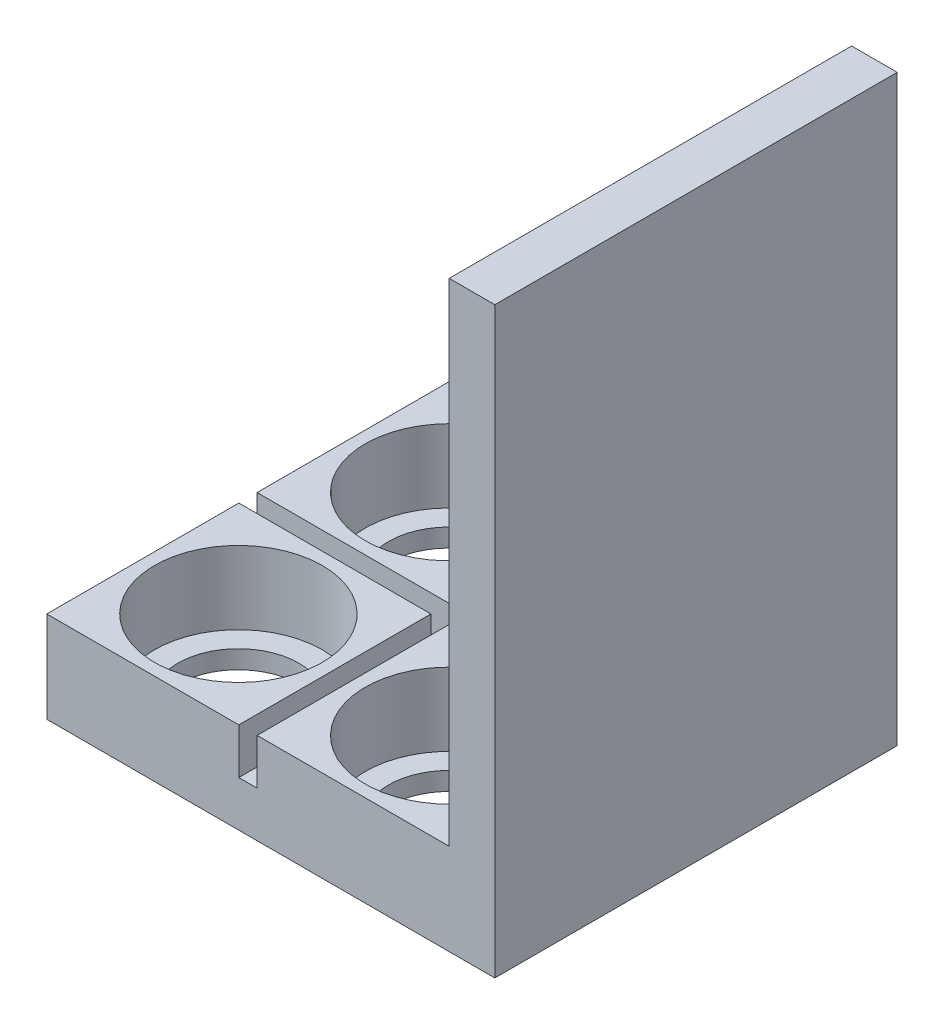
ISO-10303-21;
HEADER;
FILE_DESCRIPTION(('STEP AP214'),'2;1');
FILE_NAME('part.step','',(''),(''),'','','');
FILE_SCHEMA(('AUTOMOTIVE_DESIGN { 1 0 10303 214 1 1 1 1 }'));
ENDSEC;
DATA;
#1=APPLICATION_CONTEXT('core data for automotive mechanical design processes');
#2=APPLICATION_PROTOCOL_DEFINITION('international standard','automotive_design',2000,#1);
#3=PRODUCT_CONTEXT('',#1,'mechanical');
#4=PRODUCT('Part','Part','',(#3));
#5=PRODUCT_RELATED_PRODUCT_CATEGORY('part','',(#4));
#6=PRODUCT_DEFINITION_FORMATION('','',#4);
#7=PRODUCT_DEFINITION_CONTEXT('part definition',#1,'design');
#8=PRODUCT_DEFINITION('design','',#6,#7);
#9=PRODUCT_DEFINITION_SHAPE('','',#8);
#10=(LENGTH_UNIT() NAMED_UNIT(*) SI_UNIT(.MILLI.,.METRE.));
#11=(NAMED_UNIT(*) PLANE_ANGLE_UNIT() SI_UNIT($,.RADIAN.));
#12=(NAMED_UNIT(*) SI_UNIT($,.STERADIAN.) SOLID_ANGLE_UNIT());
#13=UNCERTAINTY_MEASURE_WITH_UNIT(LENGTH_MEASURE(1.E-05),#10,'distance_accuracy_value','');
#14=(GEOMETRIC_REPRESENTATION_CONTEXT(3) GLOBAL_UNCERTAINTY_ASSIGNED_CONTEXT((#13)) GLOBAL_UNIT_ASSIGNED_CONTEXT((#10,
#11,#12)) REPRESENTATION_CONTEXT('',''));
#15=CARTESIAN_POINT('',(0.,0.,0.));
#16=DIRECTION('',(0.,0.,1.));
#17=DIRECTION('',(1.,0.,0.));
#18=AXIS2_PLACEMENT_3D('',#15,#16,#17);
#19=CARTESIAN_POINT('',(0.,10.,0.));
#20=DIRECTION('',(0.,1.,0.));
#21=DIRECTION('',(0.,0.,1.));
#22=AXIS2_PLACEMENT_3D('',#19,#20,#21);
#23=PLANE('',#22);
#24=CARTESIAN_POINT('',(33.6,10.,11.55));
#25=DIRECTION('',(0.,1.,0.));
#26=DIRECTION('',(0.,0.,-1.));
#27=AXIS2_PLACEMENT_3D('',#24,#25,#26);
#28=CIRCLE('',#27,9.19999999999999);
#29=CARTESIAN_POINT('',(33.6,10.,2.35000000000001));
#30=VERTEX_POINT('',#29);
#31=EDGE_CURVE('E212',#30,#30,#28,.T.);
#32=ORIENTED_EDGE('',*,*,#31,.F.);
#33=EDGE_LOOP('',(#32));
#34=FACE_BOUND('',#33,.T.);
#35=DIRECTION('',(1.,0.,0.));
#36=VECTOR('',#35,1.);
#37=CARTESIAN_POINT('',(0.,10.,22.05));
#38=LINE('',#37,#36);
#39=CARTESIAN_POINT('',(23.05,10.,22.05));
#40=VERTEX_POINT('',#39);
#41=CARTESIAN_POINT('',(44.1,10.,22.05));
#42=VERTEX_POINT('',#41);
#43=EDGE_CURVE('E246',#40,#42,#38,.T.);
#44=ORIENTED_EDGE('',*,*,#43,.T.);
#45=DIRECTION('',(0.,0.,1.));
#46=VECTOR('',#45,1.);
#47=CARTESIAN_POINT('',(44.1,10.,-22.05));
#48=LINE('',#47,#46);
#49=CARTESIAN_POINT('',(44.1,10.,1.));
#50=VERTEX_POINT('',#49);
#51=EDGE_CURVE('E158',#50,#42,#48,.T.);
#52=ORIENTED_EDGE('',*,*,#51,.F.);
#53=DIRECTION('',(1.,0.,0.));
#54=VECTOR('',#53,1.);
#55=CARTESIAN_POINT('',(23.05,10.,1.));
#56=LINE('',#55,#54);
#57=CARTESIAN_POINT('',(23.05,10.,1.));
#58=VERTEX_POINT('',#57);
#59=EDGE_CURVE('E149',#58,#50,#56,.T.);
#60=ORIENTED_EDGE('',*,*,#59,.F.);
#61=DIRECTION('',(0.,0.,-1.));
#62=VECTOR('',#61,1.);
#63=CARTESIAN_POINT('',(23.05,10.,0.));
#64=LINE('',#63,#62);
#65=EDGE_CURVE('E55',#40,#58,#64,.T.);
#66=ORIENTED_EDGE('',*,*,#65,.F.);
#67=EDGE_LOOP('',(#44,#52,#60,#66));
#68=FACE_BOUND('',#67,.T.);
#69=ADVANCED_FACE('F47',(#34,#68),#23,.T.);
#70=CARTESIAN_POINT('',(33.6,10.,-11.55));
#71=DIRECTION('',(0.,-1.,0.));
#72=DIRECTION('',(0.,0.,1.));
#73=AXIS2_PLACEMENT_3D('',#70,#71,#72);
#74=CIRCLE('',#73,9.19999999999999);
#75=CARTESIAN_POINT('',(33.6,10.,-2.35000000000001));
#76=VERTEX_POINT('',#75);
#77=EDGE_CURVE('E218',#76,#76,#74,.T.);
#78=ORIENTED_EDGE('',*,*,#77,.T.);
#79=EDGE_LOOP('',(#78));
#80=FACE_BOUND('',#79,.T.);
#81=DIRECTION('',(-1.,0.,0.));
#82=VECTOR('',#81,1.);
#83=CARTESIAN_POINT('',(0.,10.,-1.));
#84=LINE('',#83,#82);
#85=CARTESIAN_POINT('',(44.1,10.,-1.00000000000003));
#86=VERTEX_POINT('',#85);
#87=CARTESIAN_POINT('',(23.05,10.,-1.00000000000001));
#88=VERTEX_POINT('',#87);
#89=EDGE_CURVE('E11',#86,#88,#84,.T.);
#90=ORIENTED_EDGE('',*,*,#89,.F.);
#91=CARTESIAN_POINT('',(44.1,10.,-22.05));
#92=VERTEX_POINT('',#91);
#93=EDGE_CURVE('E296',#92,#86,#48,.T.);
#94=ORIENTED_EDGE('',*,*,#93,.F.);
#95=DIRECTION('',(-1.,0.,0.));
#96=VECTOR('',#95,1.);
#97=CARTESIAN_POINT('',(0.,10.,-22.05));
#98=LINE('',#97,#96);
#99=CARTESIAN_POINT('',(23.05,10.,-22.05));
#100=VERTEX_POINT('',#99);
#101=EDGE_CURVE('E108',#92,#100,#98,.T.);
#102=ORIENTED_EDGE('',*,*,#101,.T.);
#103=DIRECTION('',(0.,0.,-1.));
#104=VECTOR('',#103,1.);
#105=CARTESIAN_POINT('',(23.05,10.,-22.05));
#106=LINE('',#105,#104);
#107=EDGE_CURVE('E159',#88,#100,#106,.T.);
#108=ORIENTED_EDGE('',*,*,#107,.F.);
#109=EDGE_LOOP('',(#90,#94,#102,#108));
#110=FACE_BOUND('',#109,.T.);
#111=ADVANCED_FACE('F418',(#80,#110),#23,.T.);
#112=DIRECTION('',(0.,0.,1.));
#113=VECTOR('',#112,1.);
#114=CARTESIAN_POINT('',(21.05,10.,1.));
#115=LINE('',#114,#113);
#116=CARTESIAN_POINT('',(21.05,10.,1.));
#117=VERTEX_POINT('',#116);
#118=CARTESIAN_POINT('',(21.05,10.,22.05));
#119=VERTEX_POINT('',#118);
#120=EDGE_CURVE('E160',#117,#119,#115,.T.);
#121=ORIENTED_EDGE('',*,*,#120,.F.);
#122=DIRECTION('',(1.,0.,0.));
#123=VECTOR('',#122,1.);
#124=CARTESIAN_POINT('',(0.,10.,1.));
#125=LINE('',#124,#123);
#126=CARTESIAN_POINT('',(0.,10.,1.));
#127=VERTEX_POINT('',#126);
#128=EDGE_CURVE('E166',#127,#117,#125,.T.);
#129=ORIENTED_EDGE('',*,*,#128,.F.);
#130=DIRECTION('',(0.,0.,1.));
#131=VECTOR('',#130,1.);
#132=CARTESIAN_POINT('',(0.,10.,-22.05));
#133=LINE('',#132,#131);
#134=CARTESIAN_POINT('',(0.,10.,22.05));
#135=VERTEX_POINT('',#134);
#136=EDGE_CURVE('E97',#127,#135,#133,.T.);
#137=ORIENTED_EDGE('',*,*,#136,.T.);
#138=EDGE_CURVE('E247',#135,#119,#38,.T.);
#139=ORIENTED_EDGE('',*,*,#138,.T.);
#140=EDGE_LOOP('',(#121,#129,#137,#139));
#141=FACE_BOUND('',#140,.T.);
#142=CARTESIAN_POINT('',(10.5,10.,11.55));
#143=DIRECTION('',(0.,-1.,0.));
#144=DIRECTION('',(0.,0.,-1.));
#145=AXIS2_PLACEMENT_3D('',#142,#143,#144);
#146=CIRCLE('',#145,9.19999999999999);
#147=CARTESIAN_POINT('',(10.5,10.,2.35000000000001));
#148=VERTEX_POINT('',#147);
#149=EDGE_CURVE('E230',#148,#148,#146,.T.);
#150=ORIENTED_EDGE('',*,*,#149,.T.);
#151=EDGE_LOOP('',(#150));
#152=FACE_BOUND('',#151,.T.);
#153=ADVANCED_FACE('F356',(#141,#152),#23,.T.);
#154=CARTESIAN_POINT('',(0.,10.,-22.05));
#155=DIRECTION('',(1.,0.,0.));
#156=DIRECTION('',(0.,0.,-1.));
#157=AXIS2_PLACEMENT_3D('',#154,#155,#156);
#158=PLANE('',#157);
#159=ORIENTED_EDGE('',*,*,#136,.F.);
#160=DIRECTION('',(0.,1.,0.));
#161=VECTOR('',#160,1.);
#162=CARTESIAN_POINT('',(0.,5.,1.));
#163=LINE('',#162,#161);
#164=CARTESIAN_POINT('',(0.,5.,1.));
#165=VERTEX_POINT('',#164);
#166=EDGE_CURVE('E180',#165,#127,#163,.T.);
#167=ORIENTED_EDGE('',*,*,#166,.F.);
#168=DIRECTION('',(0.,0.,1.));
#169=VECTOR('',#168,1.);
#170=CARTESIAN_POINT('',(0.,5.,-1.));
#171=LINE('',#170,#169);
#172=CARTESIAN_POINT('',(0.,5.,-1.));
#173=VERTEX_POINT('',#172);
#174=EDGE_CURVE('E327',#173,#165,#171,.T.);
#175=ORIENTED_EDGE('',*,*,#174,.F.);
#176=DIRECTION('',(0.,1.,0.));
#177=VECTOR('',#176,1.);
#178=CARTESIAN_POINT('',(0.,5.,-1.));
#179=LINE('',#178,#177);
#180=CARTESIAN_POINT('',(0.,10.,-1.));
#181=VERTEX_POINT('',#180);
#182=EDGE_CURVE('E183',#173,#181,#179,.T.);
#183=ORIENTED_EDGE('',*,*,#182,.T.);
#184=CARTESIAN_POINT('',(0.,10.,-22.05));
#185=VERTEX_POINT('',#184);
#186=EDGE_CURVE('E106',#185,#181,#133,.T.);
#187=ORIENTED_EDGE('',*,*,#186,.F.);
#188=DIRECTION('',(0.,-1.,0.));
#189=VECTOR('',#188,1.);
#190=CARTESIAN_POINT('',(0.,10.,-22.05));
#191=LINE('',#190,#189);
#192=CARTESIAN_POINT('',(0.,0.,-22.05));
#193=VERTEX_POINT('',#192);
#194=EDGE_CURVE('E87',#185,#193,#191,.T.);
#195=ORIENTED_EDGE('',*,*,#194,.T.);
#196=DIRECTION('',(0.,0.,1.));
#197=VECTOR('',#196,1.);
#198=CARTESIAN_POINT('',(0.,0.,-22.05));
#199=LINE('',#198,#197);
#200=CARTESIAN_POINT('',(0.,0.,22.05));
#201=VERTEX_POINT('',#200);
#202=EDGE_CURVE('E104',#193,#201,#199,.T.);
#203=ORIENTED_EDGE('',*,*,#202,.T.);
#204=DIRECTION('',(0.,-1.,0.));
#205=VECTOR('',#204,1.);
#206=CARTESIAN_POINT('',(0.,10.,22.05));
#207=LINE('',#206,#205);
#208=EDGE_CURVE('E107',#135,#201,#207,.T.);
#209=ORIENTED_EDGE('',*,*,#208,.F.);
#210=EDGE_LOOP('',(#159,#167,#175,#183,#187,#195,#203,#209));
#211=FACE_BOUND('',#210,.T.);
#212=ADVANCED_FACE('F49',(#211),#158,.F.);
#213=CARTESIAN_POINT('',(0.,10.,22.05));
#214=DIRECTION('',(0.,0.,-1.));
#215=DIRECTION('',(-1.,0.,0.));
#216=AXIS2_PLACEMENT_3D('',#213,#214,#215);
#217=PLANE('',#216);
#218=ORIENTED_EDGE('',*,*,#43,.F.);
#219=DIRECTION('',(0.,-1.,0.));
#220=VECTOR('',#219,1.);
#221=CARTESIAN_POINT('',(23.05,10.,22.05));
#222=LINE('',#221,#220);
#223=CARTESIAN_POINT('',(23.05,5.,22.05));
#224=VERTEX_POINT('',#223);
#225=EDGE_CURVE('E136',#40,#224,#222,.T.);
#226=ORIENTED_EDGE('',*,*,#225,.T.);
#227=DIRECTION('',(1.,0.,0.));
#228=VECTOR('',#227,1.);
#229=CARTESIAN_POINT('',(0.,5.,22.05));
#230=LINE('',#229,#228);
#231=CARTESIAN_POINT('',(21.05,5.,22.05));
#232=VERTEX_POINT('',#231);
#233=EDGE_CURVE('E199',#232,#224,#230,.T.);
#234=ORIENTED_EDGE('',*,*,#233,.F.);
#235=DIRECTION('',(0.,1.,0.));
#236=VECTOR('',#235,1.);
#237=CARTESIAN_POINT('',(21.05,10.,22.05));
#238=LINE('',#237,#236);
#239=EDGE_CURVE('E172',#232,#119,#238,.T.);
#240=ORIENTED_EDGE('',*,*,#239,.T.);
#241=ORIENTED_EDGE('',*,*,#138,.F.);
#242=ORIENTED_EDGE('',*,*,#208,.T.);
#243=DIRECTION('',(1.,0.,0.));
#244=VECTOR('',#243,1.);
#245=CARTESIAN_POINT('',(0.,0.,22.05));
#246=LINE('',#245,#244);
#247=CARTESIAN_POINT('',(49.1,0.,22.05));
#248=VERTEX_POINT('',#247);
#249=EDGE_CURVE('E98',#201,#248,#246,.T.);
#250=ORIENTED_EDGE('',*,*,#249,.T.);
#251=DIRECTION('',(0.,-1.,0.));
#252=VECTOR('',#251,1.);
#253=CARTESIAN_POINT('',(49.1,10.,22.05));
#254=LINE('',#253,#252);
#255=CARTESIAN_POINT('',(49.1,63.9,22.05));
#256=VERTEX_POINT('',#255);
#257=EDGE_CURVE('E316',#256,#248,#254,.T.);
#258=ORIENTED_EDGE('',*,*,#257,.F.);
#259=DIRECTION('',(1.,0.,0.));
#260=VECTOR('',#259,1.);
#261=CARTESIAN_POINT('',(49.1,63.9,22.05));
#262=LINE('',#261,#260);
#263=CARTESIAN_POINT('',(44.1,63.9,22.05));
#264=VERTEX_POINT('',#263);
#265=EDGE_CURVE('E312',#264,#256,#262,.T.);
#266=ORIENTED_EDGE('',*,*,#265,.F.);
#267=DIRECTION('',(0.,-1.,0.));
#268=VECTOR('',#267,1.);
#269=CARTESIAN_POINT('',(44.1,63.9,22.05));
#270=LINE('',#269,#268);
#271=EDGE_CURVE('E264',#264,#42,#270,.T.);
#272=ORIENTED_EDGE('',*,*,#271,.T.);
#273=EDGE_LOOP('',(#218,#226,#234,#240,#241,#242,#250,#258,#266,#272));
#274=FACE_BOUND('',#273,.T.);
#275=ADVANCED_FACE('F259',(#274),#217,.F.);
#276=CARTESIAN_POINT('',(0.,10.,-22.05));
#277=DIRECTION('',(0.,0.,1.));
#278=DIRECTION('',(1.,0.,0.));
#279=AXIS2_PLACEMENT_3D('',#276,#277,#278);
#280=PLANE('',#279);
#281=CARTESIAN_POINT('',(21.05,10.,-22.05));
#282=VERTEX_POINT('',#281);
#283=EDGE_CURVE('E70',#282,#185,#98,.T.);
#284=ORIENTED_EDGE('',*,*,#283,.F.);
#285=DIRECTION('',(0.,1.,0.));
#286=VECTOR('',#285,1.);
#287=CARTESIAN_POINT('',(21.05,5.,-22.05));
#288=LINE('',#287,#286);
#289=CARTESIAN_POINT('',(21.05,5.,-22.05));
#290=VERTEX_POINT('',#289);
#291=EDGE_CURVE('E170',#290,#282,#288,.T.);
#292=ORIENTED_EDGE('',*,*,#291,.F.);
#293=DIRECTION('',(-1.,0.,0.));
#294=VECTOR('',#293,1.);
#295=CARTESIAN_POINT('',(21.05,5.,-22.05));
#296=LINE('',#295,#294);
#297=CARTESIAN_POINT('',(23.05,5.,-22.05));
#298=VERTEX_POINT('',#297);
#299=EDGE_CURVE('E187',#298,#290,#296,.T.);
#300=ORIENTED_EDGE('',*,*,#299,.F.);
#301=DIRECTION('',(0.,1.,0.));
#302=VECTOR('',#301,1.);
#303=CARTESIAN_POINT('',(23.05,5.,-22.05));
#304=LINE('',#303,#302);
#305=EDGE_CURVE('E173',#298,#100,#304,.T.);
#306=ORIENTED_EDGE('',*,*,#305,.T.);
#307=ORIENTED_EDGE('',*,*,#101,.F.);
#308=DIRECTION('',(0.,-1.,0.));
#309=VECTOR('',#308,1.);
#310=CARTESIAN_POINT('',(44.1,63.9,-22.05));
#311=LINE('',#310,#309);
#312=CARTESIAN_POINT('',(44.1,63.9,-22.05));
#313=VERTEX_POINT('',#312);
#314=EDGE_CURVE('E299',#313,#92,#311,.T.);
#315=ORIENTED_EDGE('',*,*,#314,.F.);
#316=DIRECTION('',(-1.,0.,0.));
#317=VECTOR('',#316,1.);
#318=CARTESIAN_POINT('',(49.1,63.9,-22.05));
#319=LINE('',#318,#317);
#320=CARTESIAN_POINT('',(49.1,63.9,-22.05));
#321=VERTEX_POINT('',#320);
#322=EDGE_CURVE('E308',#321,#313,#319,.T.);
#323=ORIENTED_EDGE('',*,*,#322,.F.);
#324=DIRECTION('',(0.,1.,0.));
#325=VECTOR('',#324,1.);
#326=CARTESIAN_POINT('',(49.1,10.,-22.05));
#327=LINE('',#326,#325);
#328=CARTESIAN_POINT('',(49.1,0.,-22.05));
#329=VERTEX_POINT('',#328);
#330=EDGE_CURVE('E92',#329,#321,#327,.T.);
#331=ORIENTED_EDGE('',*,*,#330,.F.);
#332=DIRECTION('',(-1.,0.,0.));
#333=VECTOR('',#332,1.);
#334=CARTESIAN_POINT('',(0.,0.,-22.05));
#335=LINE('',#334,#333);
#336=EDGE_CURVE('E84',#329,#193,#335,.T.);
#337=ORIENTED_EDGE('',*,*,#336,.T.);
#338=ORIENTED_EDGE('',*,*,#194,.F.);
#339=EDGE_LOOP('',(#284,#292,#300,#306,#307,#315,#323,#331,#337,#338));
#340=FACE_BOUND('',#339,.T.);
#341=ADVANCED_FACE('F86',(#340),#280,.F.);
#342=DIRECTION('',(0.,0.,1.));
#343=VECTOR('',#342,1.);
#344=CARTESIAN_POINT('',(21.05,10.,-22.05));
#345=LINE('',#344,#343);
#346=CARTESIAN_POINT('',(21.05,10.,-1.00000000000001));
#347=VERTEX_POINT('',#346);
#348=EDGE_CURVE('E62',#282,#347,#345,.T.);
#349=ORIENTED_EDGE('',*,*,#348,.F.);
#350=ORIENTED_EDGE('',*,*,#283,.T.);
#351=ORIENTED_EDGE('',*,*,#186,.T.);
#352=DIRECTION('',(-1.,0.,0.));
#353=VECTOR('',#352,1.);
#354=CARTESIAN_POINT('',(0.,10.,-1.));
#355=LINE('',#354,#353);
#356=EDGE_CURVE('E343',#347,#181,#355,.T.);
#357=ORIENTED_EDGE('',*,*,#356,.F.);
#358=EDGE_LOOP('',(#349,#350,#351,#357));
#359=FACE_BOUND('',#358,.T.);
#360=CARTESIAN_POINT('',(10.5,10.,-11.55));
#361=DIRECTION('',(0.,1.,0.));
#362=DIRECTION('',(0.,0.,1.));
#363=AXIS2_PLACEMENT_3D('',#360,#361,#362);
#364=CIRCLE('',#363,9.19999999999999);
#365=CARTESIAN_POINT('',(10.5,10.,-2.35000000000001));
#366=VERTEX_POINT('',#365);
#367=EDGE_CURVE('E117',#366,#366,#364,.T.);
#368=ORIENTED_EDGE('',*,*,#367,.F.);
#369=EDGE_LOOP('',(#368));
#370=FACE_BOUND('',#369,.T.);
#371=ADVANCED_FACE('F412',(#359,#370),#23,.T.);
#372=CARTESIAN_POINT('',(0.,0.,0.));
#373=DIRECTION('',(0.,1.,0.));
#374=DIRECTION('',(0.,0.,1.));
#375=AXIS2_PLACEMENT_3D('',#372,#373,#374);
#376=PLANE('',#375);
#377=CARTESIAN_POINT('',(33.6,0.,-11.55));
#378=DIRECTION('',(0.,-1.,0.));
#379=DIRECTION('',(0.,0.,1.));
#380=AXIS2_PLACEMENT_3D('',#377,#378,#379);
#381=CIRCLE('',#380,6.65);
#382=CARTESIAN_POINT('',(33.6,0.,-4.9));
#383=VERTEX_POINT('',#382);
#384=EDGE_CURVE('E203',#383,#383,#381,.T.);
#385=ORIENTED_EDGE('',*,*,#384,.F.);
#386=EDGE_LOOP('',(#385));
#387=FACE_BOUND('',#386,.T.);
#388=CARTESIAN_POINT('',(33.6,0.,11.55));
#389=DIRECTION('',(0.,1.,0.));
#390=DIRECTION('',(0.,0.,-1.));
#391=AXIS2_PLACEMENT_3D('',#388,#389,#390);
#392=CIRCLE('',#391,6.65);
#393=CARTESIAN_POINT('',(33.6,0.,4.9));
#394=VERTEX_POINT('',#393);
#395=EDGE_CURVE('E209',#394,#394,#392,.T.);
#396=ORIENTED_EDGE('',*,*,#395,.T.);
#397=EDGE_LOOP('',(#396));
#398=FACE_BOUND('',#397,.T.);
#399=CARTESIAN_POINT('',(10.5,0.,11.55));
#400=DIRECTION('',(0.,-1.,0.));
#401=DIRECTION('',(0.,0.,-1.));
#402=AXIS2_PLACEMENT_3D('',#399,#400,#401);
#403=CIRCLE('',#402,6.65);
#404=CARTESIAN_POINT('',(10.5,0.,4.9));
#405=VERTEX_POINT('',#404);
#406=EDGE_CURVE('E227',#405,#405,#403,.T.);
#407=ORIENTED_EDGE('',*,*,#406,.F.);
#408=EDGE_LOOP('',(#407));
#409=FACE_BOUND('',#408,.T.);
#410=CARTESIAN_POINT('',(10.5,0.,-11.55));
#411=DIRECTION('',(0.,1.,0.));
#412=DIRECTION('',(0.,0.,1.));
#413=AXIS2_PLACEMENT_3D('',#410,#411,#412);
#414=CIRCLE('',#413,6.65);
#415=CARTESIAN_POINT('',(10.5,0.,-4.9));
#416=VERTEX_POINT('',#415);
#417=EDGE_CURVE('E239',#416,#416,#414,.T.);
#418=ORIENTED_EDGE('',*,*,#417,.T.);
#419=EDGE_LOOP('',(#418));
#420=FACE_BOUND('',#419,.T.);
#421=ORIENTED_EDGE('',*,*,#202,.F.);
#422=ORIENTED_EDGE('',*,*,#336,.F.);
#423=DIRECTION('',(0.,0.,-1.));
#424=VECTOR('',#423,1.);
#425=CARTESIAN_POINT('',(49.1,0.,22.05));
#426=LINE('',#425,#424);
#427=EDGE_CURVE('E319',#248,#329,#426,.T.);
#428=ORIENTED_EDGE('',*,*,#427,.F.);
#429=ORIENTED_EDGE('',*,*,#249,.F.);
#430=EDGE_LOOP('',(#421,#422,#428,#429));
#431=FACE_BOUND('',#430,.T.);
#432=ADVANCED_FACE('F110',(#387,#398,#409,#420,#431),#376,.F.);
#433=CARTESIAN_POINT('',(10.5,2.,-11.55));
#434=DIRECTION('',(0.,1.,0.));
#435=DIRECTION('',(0.,0.,1.));
#436=AXIS2_PLACEMENT_3D('',#433,#434,#435);
#437=CYLINDRICAL_SURFACE('',#436,9.19999999999999);
#438=CARTESIAN_POINT('',(10.5,2.,-11.55));
#439=DIRECTION('',(0.,1.,0.));
#440=DIRECTION('',(0.,0.,1.));
#441=AXIS2_PLACEMENT_3D('',#438,#439,#440);
#442=CIRCLE('',#441,9.19999999999999);
#443=CARTESIAN_POINT('',(10.5,2.,-2.35000000000001));
#444=VERTEX_POINT('',#443);
#445=EDGE_CURVE('E113',#444,#444,#442,.T.);
#446=ORIENTED_EDGE('',*,*,#445,.F.);
#447=EDGE_LOOP('',(#446));
#448=FACE_BOUND('',#447,.T.);
#449=ORIENTED_EDGE('',*,*,#367,.T.);
#450=EDGE_LOOP('',(#449));
#451=FACE_BOUND('',#450,.T.);
#452=ADVANCED_FACE('F431',(#448,#451),#437,.F.);
#453=CARTESIAN_POINT('',(0.,2.,0.));
#454=DIRECTION('',(0.,1.,0.));
#455=DIRECTION('',(0.,0.,1.));
#456=AXIS2_PLACEMENT_3D('',#453,#454,#455);
#457=PLANE('',#456);
#458=CARTESIAN_POINT('',(10.5,2.,-11.55));
#459=DIRECTION('',(0.,1.,0.));
#460=DIRECTION('',(0.,0.,1.));
#461=AXIS2_PLACEMENT_3D('',#458,#459,#460);
#462=CIRCLE('',#461,6.65);
#463=CARTESIAN_POINT('',(10.5,2.,-4.9));
#464=VERTEX_POINT('',#463);
#465=EDGE_CURVE('E236',#464,#464,#462,.T.);
#466=ORIENTED_EDGE('',*,*,#465,.F.);
#467=EDGE_LOOP('',(#466));
#468=FACE_BOUND('',#467,.T.);
#469=ORIENTED_EDGE('',*,*,#445,.T.);
#470=EDGE_LOOP('',(#469));
#471=FACE_BOUND('',#470,.T.);
#472=ADVANCED_FACE('F676',(#468,#471),#457,.T.);
#473=CARTESIAN_POINT('',(10.5,0.,-11.55));
#474=DIRECTION('',(0.,1.,0.));
#475=DIRECTION('',(0.,0.,1.));
#476=AXIS2_PLACEMENT_3D('',#473,#474,#475);
#477=CYLINDRICAL_SURFACE('',#476,6.65);
#478=ORIENTED_EDGE('',*,*,#417,.F.);
#479=EDGE_LOOP('',(#478));
#480=FACE_BOUND('',#479,.T.);
#481=ORIENTED_EDGE('',*,*,#465,.T.);
#482=EDGE_LOOP('',(#481));
#483=FACE_BOUND('',#482,.T.);
#484=ADVANCED_FACE('F666',(#480,#483),#477,.F.);
#485=CARTESIAN_POINT('',(10.5,2.,11.55));
#486=DIRECTION('',(0.,1.,0.));
#487=DIRECTION('',(0.,0.,1.));
#488=AXIS2_PLACEMENT_3D('',#485,#486,#487);
#489=CYLINDRICAL_SURFACE('',#488,9.19999999999999);
#490=CARTESIAN_POINT('',(10.5,2.,11.55));
#491=DIRECTION('',(0.,-1.,0.));
#492=DIRECTION('',(0.,0.,-1.));
#493=AXIS2_PLACEMENT_3D('',#490,#491,#492);
#494=CIRCLE('',#493,9.19999999999999);
#495=CARTESIAN_POINT('',(10.5,2.,2.35000000000001));
#496=VERTEX_POINT('',#495);
#497=EDGE_CURVE('E233',#496,#496,#494,.T.);
#498=ORIENTED_EDGE('',*,*,#497,.T.);
#499=EDGE_LOOP('',(#498));
#500=FACE_BOUND('',#499,.T.);
#501=ORIENTED_EDGE('',*,*,#149,.F.);
#502=EDGE_LOOP('',(#501));
#503=FACE_BOUND('',#502,.T.);
#504=ADVANCED_FACE('F656',(#500,#503),#489,.F.);
#505=CARTESIAN_POINT('',(0.,2.,0.));
#506=DIRECTION('',(0.,1.,0.));
#507=DIRECTION('',(0.,0.,-1.));
#508=AXIS2_PLACEMENT_3D('',#505,#506,#507);
#509=PLANE('',#508);
#510=CARTESIAN_POINT('',(10.5,2.,11.55));
#511=DIRECTION('',(0.,-1.,0.));
#512=DIRECTION('',(0.,0.,-1.));
#513=AXIS2_PLACEMENT_3D('',#510,#511,#512);
#514=CIRCLE('',#513,6.65);
#515=CARTESIAN_POINT('',(10.5,2.,4.9));
#516=VERTEX_POINT('',#515);
#517=EDGE_CURVE('E224',#516,#516,#514,.T.);
#518=ORIENTED_EDGE('',*,*,#517,.T.);
#519=EDGE_LOOP('',(#518));
#520=FACE_BOUND('',#519,.T.);
#521=ORIENTED_EDGE('',*,*,#497,.F.);
#522=EDGE_LOOP('',(#521));
#523=FACE_BOUND('',#522,.T.);
#524=ADVANCED_FACE('F646',(#520,#523),#509,.T.);
#525=CARTESIAN_POINT('',(10.5,0.,11.55));
#526=DIRECTION('',(0.,1.,0.));
#527=DIRECTION('',(0.,0.,1.));
#528=AXIS2_PLACEMENT_3D('',#525,#526,#527);
#529=CYLINDRICAL_SURFACE('',#528,6.65);
#530=ORIENTED_EDGE('',*,*,#406,.T.);
#531=EDGE_LOOP('',(#530));
#532=FACE_BOUND('',#531,.T.);
#533=ORIENTED_EDGE('',*,*,#517,.F.);
#534=EDGE_LOOP('',(#533));
#535=FACE_BOUND('',#534,.T.);
#536=ADVANCED_FACE('F636',(#532,#535),#529,.F.);
#537=CARTESIAN_POINT('',(33.6,2.,-11.55));
#538=DIRECTION('',(0.,1.,0.));
#539=DIRECTION('',(0.,0.,1.));
#540=AXIS2_PLACEMENT_3D('',#537,#538,#539);
#541=CYLINDRICAL_SURFACE('',#540,9.19999999999999);
#542=CARTESIAN_POINT('',(33.6,2.,-11.55));
#543=DIRECTION('',(0.,-1.,0.));
#544=DIRECTION('',(0.,0.,1.));
#545=AXIS2_PLACEMENT_3D('',#542,#543,#544);
#546=CIRCLE('',#545,9.19999999999999);
#547=CARTESIAN_POINT('',(33.6,2.,-2.35000000000001));
#548=VERTEX_POINT('',#547);
#549=EDGE_CURVE('E221',#548,#548,#546,.T.);
#550=ORIENTED_EDGE('',*,*,#549,.T.);
#551=EDGE_LOOP('',(#550));
#552=FACE_BOUND('',#551,.T.);
#553=ORIENTED_EDGE('',*,*,#77,.F.);
#554=EDGE_LOOP('',(#553));
#555=FACE_BOUND('',#554,.T.);
#556=ADVANCED_FACE('F626',(#552,#555),#541,.F.);
#557=CARTESIAN_POINT('',(44.1,2.,0.));
#558=DIRECTION('',(0.,1.,0.));
#559=DIRECTION('',(0.,0.,1.));
#560=AXIS2_PLACEMENT_3D('',#557,#558,#559);
#561=PLANE('',#560);
#562=CARTESIAN_POINT('',(33.6,2.,-11.55));
#563=DIRECTION('',(0.,-1.,0.));
#564=DIRECTION('',(0.,0.,1.));
#565=AXIS2_PLACEMENT_3D('',#562,#563,#564);
#566=CIRCLE('',#565,6.65);
#567=CARTESIAN_POINT('',(33.6,2.,-4.9));
#568=VERTEX_POINT('',#567);
#569=EDGE_CURVE('E202',#568,#568,#566,.T.);
#570=ORIENTED_EDGE('',*,*,#569,.T.);
#571=EDGE_LOOP('',(#570));
#572=FACE_BOUND('',#571,.T.);
#573=ORIENTED_EDGE('',*,*,#549,.F.);
#574=EDGE_LOOP('',(#573));
#575=FACE_BOUND('',#574,.T.);
#576=ADVANCED_FACE('F616',(#572,#575),#561,.T.);
#577=CARTESIAN_POINT('',(33.6,2.,11.55));
#578=DIRECTION('',(0.,1.,0.));
#579=DIRECTION('',(0.,0.,1.));
#580=AXIS2_PLACEMENT_3D('',#577,#578,#579);
#581=CYLINDRICAL_SURFACE('',#580,9.19999999999999);
#582=CARTESIAN_POINT('',(33.6,2.,11.55));
#583=DIRECTION('',(0.,1.,0.));
#584=DIRECTION('',(0.,0.,-1.));
#585=AXIS2_PLACEMENT_3D('',#582,#583,#584);
#586=CIRCLE('',#585,9.19999999999999);
#587=CARTESIAN_POINT('',(33.6,2.,2.35000000000001));
#588=VERTEX_POINT('',#587);
#589=EDGE_CURVE('E215',#588,#588,#586,.T.);
#590=ORIENTED_EDGE('',*,*,#589,.F.);
#591=EDGE_LOOP('',(#590));
#592=FACE_BOUND('',#591,.T.);
#593=ORIENTED_EDGE('',*,*,#31,.T.);
#594=EDGE_LOOP('',(#593));
#595=FACE_BOUND('',#594,.T.);
#596=ADVANCED_FACE('F606',(#592,#595),#581,.F.);
#597=CARTESIAN_POINT('',(44.1,2.,0.));
#598=DIRECTION('',(0.,1.,0.));
#599=DIRECTION('',(0.,0.,-1.));
#600=AXIS2_PLACEMENT_3D('',#597,#598,#599);
#601=PLANE('',#600);
#602=CARTESIAN_POINT('',(33.6,2.,11.55));
#603=DIRECTION('',(0.,1.,0.));
#604=DIRECTION('',(0.,0.,-1.));
#605=AXIS2_PLACEMENT_3D('',#602,#603,#604);
#606=CIRCLE('',#605,6.65);
#607=CARTESIAN_POINT('',(33.6,2.,4.9));
#608=VERTEX_POINT('',#607);
#609=EDGE_CURVE('E206',#608,#608,#606,.T.);
#610=ORIENTED_EDGE('',*,*,#609,.F.);
#611=EDGE_LOOP('',(#610));
#612=FACE_BOUND('',#611,.T.);
#613=ORIENTED_EDGE('',*,*,#589,.T.);
#614=EDGE_LOOP('',(#613));
#615=FACE_BOUND('',#614,.T.);
#616=ADVANCED_FACE('F596',(#612,#615),#601,.T.);
#617=CARTESIAN_POINT('',(33.6,0.,11.55));
#618=DIRECTION('',(0.,1.,0.));
#619=DIRECTION('',(0.,0.,1.));
#620=AXIS2_PLACEMENT_3D('',#617,#618,#619);
#621=CYLINDRICAL_SURFACE('',#620,6.65);
#622=ORIENTED_EDGE('',*,*,#395,.F.);
#623=EDGE_LOOP('',(#622));
#624=FACE_BOUND('',#623,.T.);
#625=ORIENTED_EDGE('',*,*,#609,.T.);
#626=EDGE_LOOP('',(#625));
#627=FACE_BOUND('',#626,.T.);
#628=ADVANCED_FACE('F587',(#624,#627),#621,.F.);
#629=CARTESIAN_POINT('',(33.6,0.,-11.55));
#630=DIRECTION('',(0.,1.,0.));
#631=DIRECTION('',(0.,0.,1.));
#632=AXIS2_PLACEMENT_3D('',#629,#630,#631);
#633=CYLINDRICAL_SURFACE('',#632,6.65);
#634=ORIENTED_EDGE('',*,*,#384,.T.);
#635=EDGE_LOOP('',(#634));
#636=FACE_BOUND('',#635,.T.);
#637=ORIENTED_EDGE('',*,*,#569,.F.);
#638=EDGE_LOOP('',(#637));
#639=FACE_BOUND('',#638,.T.);
#640=ADVANCED_FACE('F522',(#636,#639),#633,.F.);
#641=CARTESIAN_POINT('',(0.,5.,0.));
#642=DIRECTION('',(0.,1.,0.));
#643=DIRECTION('',(0.,0.,1.));
#644=AXIS2_PLACEMENT_3D('',#641,#642,#643);
#645=PLANE('',#644);
#646=ORIENTED_EDGE('',*,*,#233,.T.);
#647=DIRECTION('',(0.,0.,-1.));
#648=VECTOR('',#647,1.);
#649=CARTESIAN_POINT('',(23.05,5.,1.));
#650=LINE('',#649,#648);
#651=CARTESIAN_POINT('',(23.05,5.,1.));
#652=VERTEX_POINT('',#651);
#653=EDGE_CURVE('E336',#224,#652,#650,.T.);
#654=ORIENTED_EDGE('',*,*,#653,.T.);
#655=DIRECTION('',(1.,0.,0.));
#656=VECTOR('',#655,1.);
#657=CARTESIAN_POINT('',(23.05,5.,1.));
#658=LINE('',#657,#656);
#659=CARTESIAN_POINT('',(44.1,5.,1.));
#660=VERTEX_POINT('',#659);
#661=EDGE_CURVE('E152',#652,#660,#658,.T.);
#662=ORIENTED_EDGE('',*,*,#661,.T.);
#663=DIRECTION('',(0.,0.,-1.));
#664=VECTOR('',#663,1.);
#665=CARTESIAN_POINT('',(44.1,5.,-22.05));
#666=LINE('',#665,#664);
#667=CARTESIAN_POINT('',(44.1,5.,-1.00000000000003));
#668=VERTEX_POINT('',#667);
#669=EDGE_CURVE('E196',#660,#668,#666,.T.);
#670=ORIENTED_EDGE('',*,*,#669,.T.);
#671=DIRECTION('',(-1.,0.,0.));
#672=VECTOR('',#671,1.);
#673=CARTESIAN_POINT('',(23.05,5.,-1.00000000000001));
#674=LINE('',#673,#672);
#675=CARTESIAN_POINT('',(23.05,5.,-1.00000000000001));
#676=VERTEX_POINT('',#675);
#677=EDGE_CURVE('E280',#668,#676,#674,.T.);
#678=ORIENTED_EDGE('',*,*,#677,.T.);
#679=DIRECTION('',(0.,0.,-1.));
#680=VECTOR('',#679,1.);
#681=CARTESIAN_POINT('',(23.05,5.,-22.05));
#682=LINE('',#681,#680);
#683=EDGE_CURVE('E290',#676,#298,#682,.T.);
#684=ORIENTED_EDGE('',*,*,#683,.T.);
#685=ORIENTED_EDGE('',*,*,#299,.T.);
#686=DIRECTION('',(0.,0.,1.));
#687=VECTOR('',#686,1.);
#688=CARTESIAN_POINT('',(21.05,5.,-22.05));
#689=LINE('',#688,#687);
#690=CARTESIAN_POINT('',(21.05,5.,-1.00000000000001));
#691=VERTEX_POINT('',#690);
#692=EDGE_CURVE('E163',#290,#691,#689,.T.);
#693=ORIENTED_EDGE('',*,*,#692,.T.);
#694=DIRECTION('',(-1.,0.,0.));
#695=VECTOR('',#694,1.);
#696=CARTESIAN_POINT('',(0.,5.,-1.));
#697=LINE('',#696,#695);
#698=EDGE_CURVE('E324',#691,#173,#697,.T.);
#699=ORIENTED_EDGE('',*,*,#698,.T.);
#700=ORIENTED_EDGE('',*,*,#174,.T.);
#701=DIRECTION('',(1.,0.,0.));
#702=VECTOR('',#701,1.);
#703=CARTESIAN_POINT('',(0.,5.,1.));
#704=LINE('',#703,#702);
#705=CARTESIAN_POINT('',(21.05,5.,1.));
#706=VERTEX_POINT('',#705);
#707=EDGE_CURVE('E330',#165,#706,#704,.T.);
#708=ORIENTED_EDGE('',*,*,#707,.T.);
#709=DIRECTION('',(0.,0.,1.));
#710=VECTOR('',#709,1.);
#711=CARTESIAN_POINT('',(21.05,5.,1.));
#712=LINE('',#711,#710);
#713=EDGE_CURVE('E333',#706,#232,#712,.T.);
#714=ORIENTED_EDGE('',*,*,#713,.T.);
#715=EDGE_LOOP('',(#646,#654,#662,#670,#678,#684,#685,#693,#699,#700,#708,#714));
#716=FACE_BOUND('',#715,.T.);
#717=ADVANCED_FACE('F277',(#716),#645,.T.);
#718=CARTESIAN_POINT('',(23.05,5.,-1.00000000000001));
#719=DIRECTION('',(0.,0.,-1.));
#720=DIRECTION('',(-1.,0.,0.));
#721=AXIS2_PLACEMENT_3D('',#718,#719,#720);
#722=PLANE('',#721);
#723=ORIENTED_EDGE('',*,*,#89,.T.);
#724=DIRECTION('',(0.,1.,0.));
#725=VECTOR('',#724,1.);
#726=CARTESIAN_POINT('',(23.05,5.,-1.00000000000001));
#727=LINE('',#726,#725);
#728=EDGE_CURVE('E153',#676,#88,#727,.T.);
#729=ORIENTED_EDGE('',*,*,#728,.F.);
#730=ORIENTED_EDGE('',*,*,#677,.F.);
#731=DIRECTION('',(0.,-1.,0.));
#732=VECTOR('',#731,1.);
#733=CARTESIAN_POINT('',(44.1,10.,-1.00000000000003));
#734=LINE('',#733,#732);
#735=EDGE_CURVE('E193',#86,#668,#734,.T.);
#736=ORIENTED_EDGE('',*,*,#735,.F.);
#737=EDGE_LOOP('',(#723,#729,#730,#736));
#738=FACE_BOUND('',#737,.T.);
#739=ADVANCED_FACE('F286',(#738),#722,.F.);
#740=CARTESIAN_POINT('',(23.05,5.,1.));
#741=DIRECTION('',(0.,0.,1.));
#742=DIRECTION('',(1.,0.,0.));
#743=AXIS2_PLACEMENT_3D('',#740,#741,#742);
#744=PLANE('',#743);
#745=ORIENTED_EDGE('',*,*,#661,.F.);
#746=DIRECTION('',(0.,1.,0.));
#747=VECTOR('',#746,1.);
#748=CARTESIAN_POINT('',(23.05,5.,1.));
#749=LINE('',#748,#747);
#750=EDGE_CURVE('E132',#652,#58,#749,.T.);
#751=ORIENTED_EDGE('',*,*,#750,.T.);
#752=ORIENTED_EDGE('',*,*,#59,.T.);
#753=DIRECTION('',(0.,1.,0.));
#754=VECTOR('',#753,1.);
#755=CARTESIAN_POINT('',(44.1,10.,1.));
#756=LINE('',#755,#754);
#757=EDGE_CURVE('E191',#660,#50,#756,.T.);
#758=ORIENTED_EDGE('',*,*,#757,.F.);
#759=EDGE_LOOP('',(#745,#751,#752,#758));
#760=FACE_BOUND('',#759,.T.);
#761=ADVANCED_FACE('F146',(#760),#744,.F.);
#762=CARTESIAN_POINT('',(23.05,5.,1.));
#763=DIRECTION('',(1.,0.,0.));
#764=DIRECTION('',(0.,0.,-1.));
#765=AXIS2_PLACEMENT_3D('',#762,#763,#764);
#766=PLANE('',#765);
#767=ORIENTED_EDGE('',*,*,#65,.T.);
#768=ORIENTED_EDGE('',*,*,#750,.F.);
#769=ORIENTED_EDGE('',*,*,#653,.F.);
#770=ORIENTED_EDGE('',*,*,#225,.F.);
#771=EDGE_LOOP('',(#767,#768,#769,#770));
#772=FACE_BOUND('',#771,.T.);
#773=ADVANCED_FACE('F129',(#772),#766,.F.);
#774=CARTESIAN_POINT('',(21.05,5.,1.));
#775=DIRECTION('',(-1.,0.,0.));
#776=DIRECTION('',(0.,0.,1.));
#777=AXIS2_PLACEMENT_3D('',#774,#775,#776);
#778=PLANE('',#777);
#779=ORIENTED_EDGE('',*,*,#713,.F.);
#780=DIRECTION('',(0.,1.,0.));
#781=VECTOR('',#780,1.);
#782=CARTESIAN_POINT('',(21.05,5.,1.));
#783=LINE('',#782,#781);
#784=EDGE_CURVE('E154',#706,#117,#783,.T.);
#785=ORIENTED_EDGE('',*,*,#784,.T.);
#786=ORIENTED_EDGE('',*,*,#120,.T.);
#787=ORIENTED_EDGE('',*,*,#239,.F.);
#788=EDGE_LOOP('',(#779,#785,#786,#787));
#789=FACE_BOUND('',#788,.T.);
#790=ADVANCED_FACE('F359',(#789),#778,.F.);
#791=CARTESIAN_POINT('',(21.05,5.,-22.05));
#792=DIRECTION('',(-1.,0.,0.));
#793=DIRECTION('',(0.,0.,1.));
#794=AXIS2_PLACEMENT_3D('',#791,#792,#793);
#795=PLANE('',#794);
#796=ORIENTED_EDGE('',*,*,#348,.T.);
#797=DIRECTION('',(0.,1.,0.));
#798=VECTOR('',#797,1.);
#799=CARTESIAN_POINT('',(21.05,5.,-1.00000000000001));
#800=LINE('',#799,#798);
#801=EDGE_CURVE('E185',#691,#347,#800,.T.);
#802=ORIENTED_EDGE('',*,*,#801,.F.);
#803=ORIENTED_EDGE('',*,*,#692,.F.);
#804=ORIENTED_EDGE('',*,*,#291,.T.);
#805=EDGE_LOOP('',(#796,#802,#803,#804));
#806=FACE_BOUND('',#805,.T.);
#807=ADVANCED_FACE('F474',(#806),#795,.F.);
#808=CARTESIAN_POINT('',(23.05,5.,-22.05));
#809=DIRECTION('',(1.,0.,0.));
#810=DIRECTION('',(0.,0.,-1.));
#811=AXIS2_PLACEMENT_3D('',#808,#809,#810);
#812=PLANE('',#811);
#813=ORIENTED_EDGE('',*,*,#107,.T.);
#814=ORIENTED_EDGE('',*,*,#305,.F.);
#815=ORIENTED_EDGE('',*,*,#683,.F.);
#816=ORIENTED_EDGE('',*,*,#728,.T.);
#817=EDGE_LOOP('',(#813,#814,#815,#816));
#818=FACE_BOUND('',#817,.T.);
#819=ADVANCED_FACE('F416',(#818),#812,.F.);
#820=CARTESIAN_POINT('',(0.,5.,1.));
#821=DIRECTION('',(0.,0.,1.));
#822=DIRECTION('',(1.,0.,0.));
#823=AXIS2_PLACEMENT_3D('',#820,#821,#822);
#824=PLANE('',#823);
#825=ORIENTED_EDGE('',*,*,#128,.T.);
#826=ORIENTED_EDGE('',*,*,#784,.F.);
#827=ORIENTED_EDGE('',*,*,#707,.F.);
#828=ORIENTED_EDGE('',*,*,#166,.T.);
#829=EDGE_LOOP('',(#825,#826,#827,#828));
#830=FACE_BOUND('',#829,.T.);
#831=ADVANCED_FACE('F349',(#830),#824,.F.);
#832=CARTESIAN_POINT('',(0.,5.,-1.));
#833=DIRECTION('',(0.,0.,-1.));
#834=DIRECTION('',(-1.,0.,0.));
#835=AXIS2_PLACEMENT_3D('',#832,#833,#834);
#836=PLANE('',#835);
#837=ORIENTED_EDGE('',*,*,#356,.T.);
#838=ORIENTED_EDGE('',*,*,#182,.F.);
#839=ORIENTED_EDGE('',*,*,#698,.F.);
#840=ORIENTED_EDGE('',*,*,#801,.T.);
#841=EDGE_LOOP('',(#837,#838,#839,#840));
#842=FACE_BOUND('',#841,.T.);
#843=ADVANCED_FACE('F410',(#842),#836,.F.);
#844=CARTESIAN_POINT('',(44.1,0.,0.));
#845=DIRECTION('',(1.,0.,0.));
#846=DIRECTION('',(0.,0.,-1.));
#847=AXIS2_PLACEMENT_3D('',#844,#845,#846);
#848=PLANE('',#847);
#849=ORIENTED_EDGE('',*,*,#757,.T.);
#850=ORIENTED_EDGE('',*,*,#51,.T.);
#851=ORIENTED_EDGE('',*,*,#271,.F.);
#852=DIRECTION('',(0.,0.,1.));
#853=VECTOR('',#852,1.);
#854=CARTESIAN_POINT('',(44.1,63.9,-22.05));
#855=LINE('',#854,#853);
#856=EDGE_CURVE('E404',#313,#264,#855,.T.);
#857=ORIENTED_EDGE('',*,*,#856,.F.);
#858=ORIENTED_EDGE('',*,*,#314,.T.);
#859=ORIENTED_EDGE('',*,*,#93,.T.);
#860=ORIENTED_EDGE('',*,*,#735,.T.);
#861=ORIENTED_EDGE('',*,*,#669,.F.);
#862=EDGE_LOOP('',(#849,#850,#851,#857,#858,#859,#860,#861));
#863=FACE_BOUND('',#862,.T.);
#864=ADVANCED_FACE('F293',(#863),#848,.F.);
#865=CARTESIAN_POINT('',(49.1,0.,0.));
#866=DIRECTION('',(1.,0.,0.));
#867=DIRECTION('',(0.,0.,-1.));
#868=AXIS2_PLACEMENT_3D('',#865,#866,#867);
#869=PLANE('',#868);
#870=ORIENTED_EDGE('',*,*,#257,.T.);
#871=ORIENTED_EDGE('',*,*,#427,.T.);
#872=ORIENTED_EDGE('',*,*,#330,.T.);
#873=DIRECTION('',(0.,0.,-1.));
#874=VECTOR('',#873,1.);
#875=CARTESIAN_POINT('',(49.1,63.9,-22.05));
#876=LINE('',#875,#874);
#877=EDGE_CURVE('E305',#256,#321,#876,.T.);
#878=ORIENTED_EDGE('',*,*,#877,.F.);
#879=EDGE_LOOP('',(#870,#871,#872,#878));
#880=FACE_BOUND('',#879,.T.);
#881=ADVANCED_FACE('F402',(#880),#869,.T.);
#882=CARTESIAN_POINT('',(0.,63.9,0.));
#883=DIRECTION('',(0.,-1.,0.));
#884=DIRECTION('',(0.,0.,-1.));
#885=AXIS2_PLACEMENT_3D('',#882,#883,#884);
#886=PLANE('',#885);
#887=ORIENTED_EDGE('',*,*,#877,.T.);
#888=ORIENTED_EDGE('',*,*,#322,.T.);
#889=ORIENTED_EDGE('',*,*,#856,.T.);
#890=ORIENTED_EDGE('',*,*,#265,.T.);
#891=EDGE_LOOP('',(#887,#888,#889,#890));
#892=FACE_BOUND('',#891,.T.);
#893=ADVANCED_FACE('F407',(#892),#886,.F.);
#894=CLOSED_SHELL('',(#69,#111,#153,#212,#275,#341,#371,#432,#452,#472,#484,#504,#524,#536,#556,
#576,#596,#616,#628,#640,#717,#739,#761,#773,#790,#807,#819,#831,#843,#864,#881,#893));
#895=MANIFOLD_SOLID_BREP('B2',#894);
#896=ADVANCED_BREP_SHAPE_REPRESENTATION('',(#18,#895),#14);
#897=SHAPE_DEFINITION_REPRESENTATION(#9,#896);
ENDSEC;
END-ISO-10303-21;
